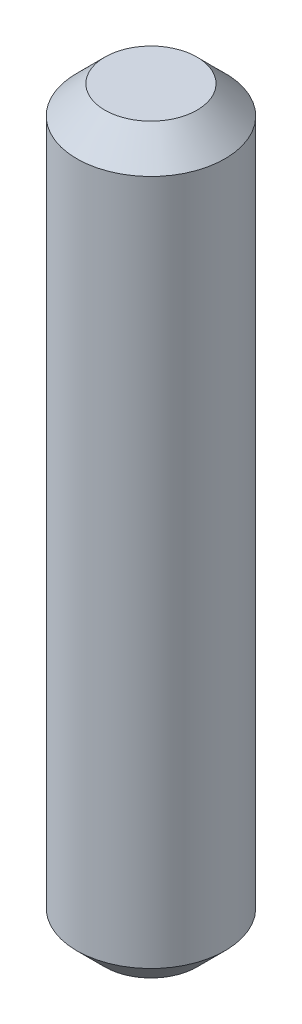
ISO-10303-21;
HEADER;
FILE_DESCRIPTION(('STEP AP214'),'2;1');
FILE_NAME('part.step','',(''),(''),'','','');
FILE_SCHEMA(('AUTOMOTIVE_DESIGN { 1 0 10303 214 1 1 1 1 }'));
ENDSEC;
DATA;
#1=APPLICATION_CONTEXT('core data for automotive mechanical design processes');
#2=APPLICATION_PROTOCOL_DEFINITION('international standard','automotive_design',2000,#1);
#3=PRODUCT_CONTEXT('',#1,'mechanical');
#4=PRODUCT('Part','Part','',(#3));
#5=PRODUCT_RELATED_PRODUCT_CATEGORY('part','',(#4));
#6=PRODUCT_DEFINITION_FORMATION('','',#4);
#7=PRODUCT_DEFINITION_CONTEXT('part definition',#1,'design');
#8=PRODUCT_DEFINITION('design','',#6,#7);
#9=PRODUCT_DEFINITION_SHAPE('','',#8);
#10=(LENGTH_UNIT() NAMED_UNIT(*) SI_UNIT(.MILLI.,.METRE.));
#11=(NAMED_UNIT(*) PLANE_ANGLE_UNIT() SI_UNIT($,.RADIAN.));
#12=(NAMED_UNIT(*) SI_UNIT($,.STERADIAN.) SOLID_ANGLE_UNIT());
#13=UNCERTAINTY_MEASURE_WITH_UNIT(LENGTH_MEASURE(1.E-05),#10,'distance_accuracy_value','');
#14=(GEOMETRIC_REPRESENTATION_CONTEXT(3) GLOBAL_UNCERTAINTY_ASSIGNED_CONTEXT((#13)) GLOBAL_UNIT_ASSIGNED_CONTEXT((#10,
#11,#12)) REPRESENTATION_CONTEXT('',''));
#15=CARTESIAN_POINT('',(0.,0.,0.));
#16=DIRECTION('',(0.,0.,1.));
#17=DIRECTION('',(1.,0.,0.));
#18=AXIS2_PLACEMENT_3D('',#15,#16,#17);
#19=CARTESIAN_POINT('',(0.,-7.935,0.));
#20=DIRECTION('',(0.,1.,0.));
#21=DIRECTION('',(0.,0.,1.));
#22=AXIS2_PLACEMENT_3D('',#19,#20,#21);
#23=CYLINDRICAL_SURFACE('',#22,1.585);
#24=CARTESIAN_POINT('',(0.,-7.335,0.));
#25=DIRECTION('',(0.,1.,0.));
#26=DIRECTION('',(0.,0.,1.));
#27=AXIS2_PLACEMENT_3D('',#24,#25,#26);
#28=CIRCLE('',#27,1.585);
#29=CARTESIAN_POINT('',(0.,-7.335,1.585));
#30=VERTEX_POINT('',#29);
#31=EDGE_CURVE('E53',#30,#30,#28,.T.);
#32=ORIENTED_EDGE('',*,*,#31,.T.);
#33=EDGE_LOOP('',(#32));
#34=FACE_BOUND('',#33,.T.);
#35=CARTESIAN_POINT('',(0.,7.335,0.));
#36=DIRECTION('',(0.,1.,0.));
#37=DIRECTION('',(0.,0.,1.));
#38=AXIS2_PLACEMENT_3D('',#35,#36,#37);
#39=CIRCLE('',#38,1.585);
#40=CARTESIAN_POINT('',(0.,7.335,1.585));
#41=VERTEX_POINT('',#40);
#42=EDGE_CURVE('E58',#41,#41,#39,.F.);
#43=ORIENTED_EDGE('',*,*,#42,.T.);
#44=EDGE_LOOP('',(#43));
#45=FACE_BOUND('',#44,.T.);
#46=ADVANCED_FACE('F39',(#34,#45),#23,.T.);
#47=CARTESIAN_POINT('',(0.,-7.935,0.));
#48=DIRECTION('',(0.,1.,0.));
#49=DIRECTION('',(0.,0.,1.));
#50=AXIS2_PLACEMENT_3D('',#47,#48,#49);
#51=PLANE('',#50);
#52=CARTESIAN_POINT('',(0.,-7.935,0.));
#53=DIRECTION('',(0.,1.,0.));
#54=DIRECTION('',(0.,0.,1.));
#55=AXIS2_PLACEMENT_3D('',#52,#53,#54);
#56=CIRCLE('',#55,0.985);
#57=CARTESIAN_POINT('',(0.,-7.935,0.985));
#58=VERTEX_POINT('',#57);
#59=EDGE_CURVE('E48',#58,#58,#56,.F.);
#60=ORIENTED_EDGE('',*,*,#59,.T.);
#61=EDGE_LOOP('',(#60));
#62=FACE_BOUND('',#61,.T.);
#63=ADVANCED_FACE('F75',(#62),#51,.F.);
#64=CARTESIAN_POINT('',(0.,7.935,0.));
#65=DIRECTION('',(0.,1.,0.));
#66=DIRECTION('',(0.,0.,1.));
#67=AXIS2_PLACEMENT_3D('',#64,#65,#66);
#68=PLANE('',#67);
#69=CARTESIAN_POINT('',(0.,7.935,0.));
#70=DIRECTION('',(0.,1.,0.));
#71=DIRECTION('',(0.,0.,1.));
#72=AXIS2_PLACEMENT_3D('',#69,#70,#71);
#73=CIRCLE('',#72,0.985000000000002);
#74=CARTESIAN_POINT('',(0.,7.935,0.985000000000002));
#75=VERTEX_POINT('',#74);
#76=EDGE_CURVE('E10',#75,#75,#73,.T.);
#77=ORIENTED_EDGE('',*,*,#76,.T.);
#78=EDGE_LOOP('',(#77));
#79=FACE_BOUND('',#78,.T.);
#80=ADVANCED_FACE('F72',(#79),#68,.T.);
#81=CARTESIAN_POINT('',(0.,-7.335,0.));
#82=DIRECTION('',(0.,1.,0.));
#83=DIRECTION('',(0.,0.,1.));
#84=AXIS2_PLACEMENT_3D('',#81,#82,#83);
#85=CONICAL_SURFACE('',#84,1.585,0.78539816339745);
#86=ORIENTED_EDGE('',*,*,#59,.F.);
#87=EDGE_LOOP('',(#86));
#88=FACE_BOUND('',#87,.T.);
#89=ORIENTED_EDGE('',*,*,#31,.F.);
#90=EDGE_LOOP('',(#89));
#91=FACE_BOUND('',#90,.T.);
#92=ADVANCED_FACE('F68',(#88,#91),#85,.T.);
#93=CARTESIAN_POINT('',(0.,7.935,0.));
#94=DIRECTION('',(0.,-1.,0.));
#95=DIRECTION('',(0.,0.,-1.));
#96=AXIS2_PLACEMENT_3D('',#93,#94,#95);
#97=CONICAL_SURFACE('',#96,0.985000000000002,0.785398163397447);
#98=ORIENTED_EDGE('',*,*,#42,.F.);
#99=EDGE_LOOP('',(#98));
#100=FACE_BOUND('',#99,.T.);
#101=ORIENTED_EDGE('',*,*,#76,.F.);
#102=EDGE_LOOP('',(#101));
#103=FACE_BOUND('',#102,.T.);
#104=ADVANCED_FACE('F42',(#100,#103),#97,.T.);
#105=CLOSED_SHELL('',(#46,#63,#80,#92,#104));
#106=MANIFOLD_SOLID_BREP('B2',#105);
#107=ADVANCED_BREP_SHAPE_REPRESENTATION('',(#18,#106),#14);
#108=SHAPE_DEFINITION_REPRESENTATION(#9,#107);
ENDSEC;
END-ISO-10303-21;
